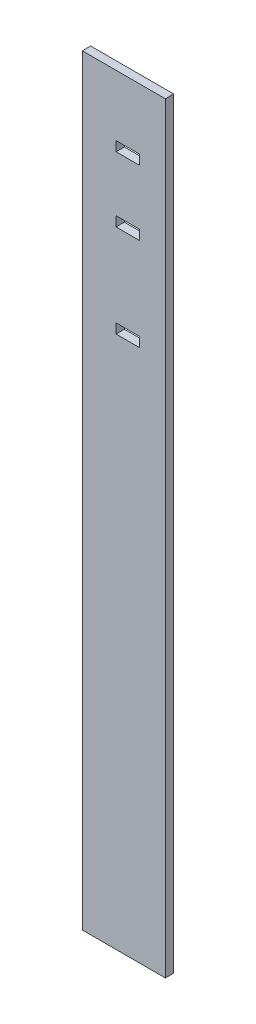
ISO-10303-21;
HEADER;
FILE_DESCRIPTION(('STEP AP214'),'2;1');
FILE_NAME('part.step','',(''),(''),'','','');
FILE_SCHEMA(('AUTOMOTIVE_DESIGN { 1 0 10303 214 1 1 1 1 }'));
ENDSEC;
DATA;
#1=APPLICATION_CONTEXT('core data for automotive mechanical design processes');
#2=APPLICATION_PROTOCOL_DEFINITION('international standard','automotive_design',2000,#1);
#3=PRODUCT_CONTEXT('',#1,'mechanical');
#4=PRODUCT('Part','Part','',(#3));
#5=PRODUCT_RELATED_PRODUCT_CATEGORY('part','',(#4));
#6=PRODUCT_DEFINITION_FORMATION('','',#4);
#7=PRODUCT_DEFINITION_CONTEXT('part definition',#1,'design');
#8=PRODUCT_DEFINITION('design','',#6,#7);
#9=PRODUCT_DEFINITION_SHAPE('','',#8);
#10=(LENGTH_UNIT() NAMED_UNIT(*) SI_UNIT(.MILLI.,.METRE.));
#11=(NAMED_UNIT(*) PLANE_ANGLE_UNIT() SI_UNIT($,.RADIAN.));
#12=(NAMED_UNIT(*) SI_UNIT($,.STERADIAN.) SOLID_ANGLE_UNIT());
#13=UNCERTAINTY_MEASURE_WITH_UNIT(LENGTH_MEASURE(1.E-05),#10,'distance_accuracy_value','');
#14=(GEOMETRIC_REPRESENTATION_CONTEXT(3) GLOBAL_UNCERTAINTY_ASSIGNED_CONTEXT((#13)) GLOBAL_UNIT_ASSIGNED_CONTEXT((#10,
#11,#12)) REPRESENTATION_CONTEXT('',''));
#15=CARTESIAN_POINT('',(0.,0.,0.));
#16=DIRECTION('',(0.,0.,1.));
#17=DIRECTION('',(1.,0.,0.));
#18=AXIS2_PLACEMENT_3D('',#15,#16,#17);
#19=CARTESIAN_POINT('',(15.,137.5,3.));
#20=DIRECTION('',(0.,-1.,0.));
#21=DIRECTION('',(0.,0.,-1.));
#22=AXIS2_PLACEMENT_3D('',#19,#20,#21);
#23=PLANE('',#22);
#24=DIRECTION('',(-1.,0.,0.));
#25=VECTOR('',#24,1.);
#26=CARTESIAN_POINT('',(15.,137.5,0.));
#27=LINE('',#26,#25);
#28=CARTESIAN_POINT('',(15.,137.5,0.));
#29=VERTEX_POINT('',#28);
#30=CARTESIAN_POINT('',(-15.,137.5,0.));
#31=VERTEX_POINT('',#30);
#32=EDGE_CURVE('E288',#29,#31,#27,.T.);
#33=ORIENTED_EDGE('',*,*,#32,.T.);
#34=DIRECTION('',(0.,0.,-1.));
#35=VECTOR('',#34,1.);
#36=CARTESIAN_POINT('',(-15.,137.5,3.));
#37=LINE('',#36,#35);
#38=CARTESIAN_POINT('',(-15.,137.5,3.));
#39=VERTEX_POINT('',#38);
#40=EDGE_CURVE('E11',#39,#31,#37,.T.);
#41=ORIENTED_EDGE('',*,*,#40,.F.);
#42=DIRECTION('',(-1.,0.,0.));
#43=VECTOR('',#42,1.);
#44=CARTESIAN_POINT('',(15.,137.5,3.));
#45=LINE('',#44,#43);
#46=CARTESIAN_POINT('',(15.,137.5,3.));
#47=VERTEX_POINT('',#46);
#48=EDGE_CURVE('E298',#47,#39,#45,.T.);
#49=ORIENTED_EDGE('',*,*,#48,.F.);
#50=DIRECTION('',(0.,0.,-1.));
#51=VECTOR('',#50,1.);
#52=CARTESIAN_POINT('',(15.,137.5,3.));
#53=LINE('',#52,#51);
#54=EDGE_CURVE('E312',#47,#29,#53,.T.);
#55=ORIENTED_EDGE('',*,*,#54,.T.);
#56=EDGE_LOOP('',(#33,#41,#49,#55));
#57=FACE_BOUND('',#56,.T.);
#58=ADVANCED_FACE('F46',(#57),#23,.F.);
#59=CARTESIAN_POINT('',(-15.,-137.5,3.));
#60=DIRECTION('',(1.,0.,0.));
#61=DIRECTION('',(0.,0.,-1.));
#62=AXIS2_PLACEMENT_3D('',#59,#60,#61);
#63=PLANE('',#62);
#64=DIRECTION('',(0.,-1.,0.));
#65=VECTOR('',#64,1.);
#66=CARTESIAN_POINT('',(-15.,-137.5,0.));
#67=LINE('',#66,#65);
#68=CARTESIAN_POINT('',(-15.,-137.5,0.));
#69=VERTEX_POINT('',#68);
#70=EDGE_CURVE('E316',#31,#69,#67,.T.);
#71=ORIENTED_EDGE('',*,*,#70,.T.);
#72=DIRECTION('',(0.,0.,-1.));
#73=VECTOR('',#72,1.);
#74=CARTESIAN_POINT('',(-15.,-137.5,3.));
#75=LINE('',#74,#73);
#76=CARTESIAN_POINT('',(-15.,-137.5,3.));
#77=VERTEX_POINT('',#76);
#78=EDGE_CURVE('E54',#77,#69,#75,.T.);
#79=ORIENTED_EDGE('',*,*,#78,.F.);
#80=DIRECTION('',(0.,-1.,0.));
#81=VECTOR('',#80,1.);
#82=CARTESIAN_POINT('',(-15.,-137.5,3.));
#83=LINE('',#82,#81);
#84=EDGE_CURVE('E302',#39,#77,#83,.T.);
#85=ORIENTED_EDGE('',*,*,#84,.F.);
#86=ORIENTED_EDGE('',*,*,#40,.T.);
#87=EDGE_LOOP('',(#71,#79,#85,#86));
#88=FACE_BOUND('',#87,.T.);
#89=ADVANCED_FACE('F351',(#88),#63,.F.);
#90=CARTESIAN_POINT('',(15.,-137.5,3.));
#91=DIRECTION('',(0.,1.,0.));
#92=DIRECTION('',(0.,0.,1.));
#93=AXIS2_PLACEMENT_3D('',#90,#91,#92);
#94=PLANE('',#93);
#95=DIRECTION('',(1.,0.,0.));
#96=VECTOR('',#95,1.);
#97=CARTESIAN_POINT('',(15.,-137.5,0.));
#98=LINE('',#97,#96);
#99=CARTESIAN_POINT('',(15.,-137.5,0.));
#100=VERTEX_POINT('',#99);
#101=EDGE_CURVE('E319',#69,#100,#98,.T.);
#102=ORIENTED_EDGE('',*,*,#101,.T.);
#103=DIRECTION('',(0.,0.,-1.));
#104=VECTOR('',#103,1.);
#105=CARTESIAN_POINT('',(15.,-137.5,3.));
#106=LINE('',#105,#104);
#107=CARTESIAN_POINT('',(15.,-137.5,3.));
#108=VERTEX_POINT('',#107);
#109=EDGE_CURVE('E327',#108,#100,#106,.T.);
#110=ORIENTED_EDGE('',*,*,#109,.F.);
#111=DIRECTION('',(1.,0.,0.));
#112=VECTOR('',#111,1.);
#113=CARTESIAN_POINT('',(15.,-137.5,3.));
#114=LINE('',#113,#112);
#115=EDGE_CURVE('E306',#77,#108,#114,.T.);
#116=ORIENTED_EDGE('',*,*,#115,.F.);
#117=ORIENTED_EDGE('',*,*,#78,.T.);
#118=EDGE_LOOP('',(#102,#110,#116,#117));
#119=FACE_BOUND('',#118,.T.);
#120=ADVANCED_FACE('F336',(#119),#94,.F.);
#121=CARTESIAN_POINT('',(15.,-137.5,3.));
#122=DIRECTION('',(-1.,0.,0.));
#123=DIRECTION('',(0.,0.,1.));
#124=AXIS2_PLACEMENT_3D('',#121,#122,#123);
#125=PLANE('',#124);
#126=DIRECTION('',(0.,1.,0.));
#127=VECTOR('',#126,1.);
#128=CARTESIAN_POINT('',(15.,-137.5,0.));
#129=LINE('',#128,#127);
#130=EDGE_CURVE('E303',#100,#29,#129,.T.);
#131=ORIENTED_EDGE('',*,*,#130,.T.);
#132=ORIENTED_EDGE('',*,*,#54,.F.);
#133=DIRECTION('',(0.,1.,0.));
#134=VECTOR('',#133,1.);
#135=CARTESIAN_POINT('',(15.,-137.5,3.));
#136=LINE('',#135,#134);
#137=EDGE_CURVE('E309',#108,#47,#136,.T.);
#138=ORIENTED_EDGE('',*,*,#137,.F.);
#139=ORIENTED_EDGE('',*,*,#109,.T.);
#140=EDGE_LOOP('',(#131,#132,#138,#139));
#141=FACE_BOUND('',#140,.T.);
#142=ADVANCED_FACE('F345',(#141),#125,.F.);
#143=CARTESIAN_POINT('',(0.,0.,3.));
#144=DIRECTION('',(0.,0.,-1.));
#145=DIRECTION('',(-1.,0.,0.));
#146=AXIS2_PLACEMENT_3D('',#143,#144,#145);
#147=PLANE('',#146);
#148=DIRECTION('',(0.,1.,0.));
#149=VECTOR('',#148,1.);
#150=CARTESIAN_POINT('',(-2.80924040930811,0.,3.));
#151=LINE('',#150,#149);
#152=CARTESIAN_POINT('',(-2.80924040930811,54.9999999999997,3.));
#153=VERTEX_POINT('',#152);
#154=CARTESIAN_POINT('',(-2.80924040930811,58.4999999999997,3.));
#155=VERTEX_POINT('',#154);
#156=EDGE_CURVE('E224',#153,#155,#151,.T.);
#157=ORIENTED_EDGE('',*,*,#156,.T.);
#158=DIRECTION('',(1.,0.,0.));
#159=VECTOR('',#158,1.);
#160=CARTESIAN_POINT('',(0.,58.4999999999997,3.));
#161=LINE('',#160,#159);
#162=CARTESIAN_POINT('',(5.69075959069189,58.4999999999997,3.));
#163=VERTEX_POINT('',#162);
#164=EDGE_CURVE('E213',#155,#163,#161,.T.);
#165=ORIENTED_EDGE('',*,*,#164,.T.);
#166=DIRECTION('',(0.,-1.,0.));
#167=VECTOR('',#166,1.);
#168=CARTESIAN_POINT('',(5.69075959069189,0.,3.));
#169=LINE('',#168,#167);
#170=CARTESIAN_POINT('',(5.69075959069189,54.9999999999997,3.));
#171=VERTEX_POINT('',#170);
#172=EDGE_CURVE('E217',#163,#171,#169,.T.);
#173=ORIENTED_EDGE('',*,*,#172,.T.);
#174=DIRECTION('',(-1.,0.,0.));
#175=VECTOR('',#174,1.);
#176=CARTESIAN_POINT('',(0.,54.9999999999997,3.));
#177=LINE('',#176,#175);
#178=EDGE_CURVE('E61',#171,#153,#177,.T.);
#179=ORIENTED_EDGE('',*,*,#178,.T.);
#180=EDGE_LOOP('',(#157,#165,#173,#179));
#181=FACE_BOUND('',#180,.T.);
#182=DIRECTION('',(0.,-1.,0.));
#183=VECTOR('',#182,1.);
#184=CARTESIAN_POINT('',(5.69075959069187,0.,3.));
#185=LINE('',#184,#183);
#186=CARTESIAN_POINT('',(5.6907595906919,115.5,3.));
#187=VERTEX_POINT('',#186);
#188=CARTESIAN_POINT('',(5.6907595906919,112.,3.));
#189=VERTEX_POINT('',#188);
#190=EDGE_CURVE('E172',#187,#189,#185,.T.);
#191=ORIENTED_EDGE('',*,*,#190,.T.);
#192=DIRECTION('',(-1.,0.,0.));
#193=VECTOR('',#192,1.);
#194=CARTESIAN_POINT('',(0.,112.,3.));
#195=LINE('',#194,#193);
#196=CARTESIAN_POINT('',(-2.8092404093081,112.,3.));
#197=VERTEX_POINT('',#196);
#198=EDGE_CURVE('E163',#189,#197,#195,.T.);
#199=ORIENTED_EDGE('',*,*,#198,.T.);
#200=DIRECTION('',(0.,1.,0.));
#201=VECTOR('',#200,1.);
#202=CARTESIAN_POINT('',(-2.80924040930813,0.,3.));
#203=LINE('',#202,#201);
#204=CARTESIAN_POINT('',(-2.8092404093081,115.5,3.));
#205=VERTEX_POINT('',#204);
#206=EDGE_CURVE('E175',#197,#205,#203,.T.);
#207=ORIENTED_EDGE('',*,*,#206,.T.);
#208=DIRECTION('',(1.,0.,0.));
#209=VECTOR('',#208,1.);
#210=CARTESIAN_POINT('',(0.,115.5,3.));
#211=LINE('',#210,#209);
#212=EDGE_CURVE('E69',#205,#187,#211,.T.);
#213=ORIENTED_EDGE('',*,*,#212,.T.);
#214=EDGE_LOOP('',(#191,#199,#207,#213));
#215=FACE_BOUND('',#214,.T.);
#216=DIRECTION('',(0.,1.,0.));
#217=VECTOR('',#216,1.);
#218=CARTESIAN_POINT('',(-2.8092404093081,0.,3.));
#219=LINE('',#218,#217);
#220=CARTESIAN_POINT('',(-2.8092404093081,88.4999999999997,3.));
#221=VERTEX_POINT('',#220);
#222=CARTESIAN_POINT('',(-2.8092404093081,91.9999999999997,3.));
#223=VERTEX_POINT('',#222);
#224=EDGE_CURVE('E267',#221,#223,#219,.T.);
#225=ORIENTED_EDGE('',*,*,#224,.T.);
#226=DIRECTION('',(1.,0.,0.));
#227=VECTOR('',#226,1.);
#228=CARTESIAN_POINT('',(0.,91.9999999999997,3.));
#229=LINE('',#228,#227);
#230=CARTESIAN_POINT('',(5.6907595906919,91.9999999999997,3.));
#231=VERTEX_POINT('',#230);
#232=EDGE_CURVE('E254',#223,#231,#229,.T.);
#233=ORIENTED_EDGE('',*,*,#232,.T.);
#234=DIRECTION('',(0.,-1.,0.));
#235=VECTOR('',#234,1.);
#236=CARTESIAN_POINT('',(5.69075959069185,0.,3.));
#237=LINE('',#236,#235);
#238=CARTESIAN_POINT('',(5.6907595906919,88.4999999999997,3.));
#239=VERTEX_POINT('',#238);
#240=EDGE_CURVE('E258',#231,#239,#237,.T.);
#241=ORIENTED_EDGE('',*,*,#240,.T.);
#242=DIRECTION('',(-1.,0.,0.));
#243=VECTOR('',#242,1.);
#244=CARTESIAN_POINT('',(0.,88.4999999999997,3.));
#245=LINE('',#244,#243);
#246=EDGE_CURVE('E263',#239,#221,#245,.T.);
#247=ORIENTED_EDGE('',*,*,#246,.T.);
#248=EDGE_LOOP('',(#225,#233,#241,#247));
#249=FACE_BOUND('',#248,.T.);
#250=ORIENTED_EDGE('',*,*,#48,.T.);
#251=ORIENTED_EDGE('',*,*,#84,.T.);
#252=ORIENTED_EDGE('',*,*,#115,.T.);
#253=ORIENTED_EDGE('',*,*,#137,.T.);
#254=EDGE_LOOP('',(#250,#251,#252,#253));
#255=FACE_BOUND('',#254,.T.);
#256=ADVANCED_FACE('F180',(#181,#215,#249,#255),#147,.F.);
#257=CARTESIAN_POINT('',(0.,0.,0.));
#258=DIRECTION('',(0.,0.,-1.));
#259=DIRECTION('',(-1.,0.,0.));
#260=AXIS2_PLACEMENT_3D('',#257,#258,#259);
#261=PLANE('',#260);
#262=DIRECTION('',(1.,0.,0.));
#263=VECTOR('',#262,1.);
#264=CARTESIAN_POINT('',(0.,58.4999999999997,0.));
#265=LINE('',#264,#263);
#266=CARTESIAN_POINT('',(-2.80924040930811,58.4999999999997,0.));
#267=VERTEX_POINT('',#266);
#268=CARTESIAN_POINT('',(5.69075959069189,58.4999999999997,0.));
#269=VERTEX_POINT('',#268);
#270=EDGE_CURVE('E229',#267,#269,#265,.T.);
#271=ORIENTED_EDGE('',*,*,#270,.F.);
#272=DIRECTION('',(0.,1.,0.));
#273=VECTOR('',#272,1.);
#274=CARTESIAN_POINT('',(-2.80924040930811,0.,0.));
#275=LINE('',#274,#273);
#276=CARTESIAN_POINT('',(-2.80924040930811,54.9999999999997,0.));
#277=VERTEX_POINT('',#276);
#278=EDGE_CURVE('E218',#277,#267,#275,.T.);
#279=ORIENTED_EDGE('',*,*,#278,.F.);
#280=DIRECTION('',(-1.,0.,0.));
#281=VECTOR('',#280,1.);
#282=CARTESIAN_POINT('',(0.,54.9999999999997,0.));
#283=LINE('',#282,#281);
#284=CARTESIAN_POINT('',(5.69075959069189,54.9999999999997,0.));
#285=VERTEX_POINT('',#284);
#286=EDGE_CURVE('E236',#285,#277,#283,.T.);
#287=ORIENTED_EDGE('',*,*,#286,.F.);
#288=DIRECTION('',(0.,-1.,0.));
#289=VECTOR('',#288,1.);
#290=CARTESIAN_POINT('',(5.69075959069189,0.,0.));
#291=LINE('',#290,#289);
#292=EDGE_CURVE('E232',#269,#285,#291,.T.);
#293=ORIENTED_EDGE('',*,*,#292,.F.);
#294=EDGE_LOOP('',(#271,#279,#287,#293));
#295=FACE_BOUND('',#294,.T.);
#296=DIRECTION('',(-1.,0.,0.));
#297=VECTOR('',#296,1.);
#298=CARTESIAN_POINT('',(0.,112.,0.));
#299=LINE('',#298,#297);
#300=CARTESIAN_POINT('',(5.6907595906919,112.,0.));
#301=VERTEX_POINT('',#300);
#302=CARTESIAN_POINT('',(-2.8092404093081,112.,0.));
#303=VERTEX_POINT('',#302);
#304=EDGE_CURVE('E166',#301,#303,#299,.T.);
#305=ORIENTED_EDGE('',*,*,#304,.F.);
#306=DIRECTION('',(0.,-1.,0.));
#307=VECTOR('',#306,1.);
#308=CARTESIAN_POINT('',(5.69075959069187,0.,0.));
#309=LINE('',#308,#307);
#310=CARTESIAN_POINT('',(5.6907595906919,115.5,0.));
#311=VERTEX_POINT('',#310);
#312=EDGE_CURVE('E184',#311,#301,#309,.T.);
#313=ORIENTED_EDGE('',*,*,#312,.F.);
#314=DIRECTION('',(1.,0.,0.));
#315=VECTOR('',#314,1.);
#316=CARTESIAN_POINT('',(0.,115.5,0.));
#317=LINE('',#316,#315);
#318=CARTESIAN_POINT('',(-2.8092404093081,115.5,0.));
#319=VERTEX_POINT('',#318);
#320=EDGE_CURVE('E188',#319,#311,#317,.T.);
#321=ORIENTED_EDGE('',*,*,#320,.F.);
#322=DIRECTION('',(0.,1.,0.));
#323=VECTOR('',#322,1.);
#324=CARTESIAN_POINT('',(-2.80924040930813,0.,0.));
#325=LINE('',#324,#323);
#326=EDGE_CURVE('E197',#303,#319,#325,.T.);
#327=ORIENTED_EDGE('',*,*,#326,.F.);
#328=EDGE_LOOP('',(#305,#313,#321,#327));
#329=FACE_BOUND('',#328,.T.);
#330=DIRECTION('',(1.,0.,0.));
#331=VECTOR('',#330,1.);
#332=CARTESIAN_POINT('',(0.,91.9999999999997,0.));
#333=LINE('',#332,#331);
#334=CARTESIAN_POINT('',(-2.8092404093081,91.9999999999997,0.));
#335=VERTEX_POINT('',#334);
#336=CARTESIAN_POINT('',(5.6907595906919,91.9999999999997,0.));
#337=VERTEX_POINT('',#336);
#338=EDGE_CURVE('E207',#335,#337,#333,.T.);
#339=ORIENTED_EDGE('',*,*,#338,.F.);
#340=DIRECTION('',(0.,1.,0.));
#341=VECTOR('',#340,1.);
#342=CARTESIAN_POINT('',(-2.8092404093081,0.,0.));
#343=LINE('',#342,#341);
#344=CARTESIAN_POINT('',(-2.8092404093081,88.4999999999997,0.));
#345=VERTEX_POINT('',#344);
#346=EDGE_CURVE('E259',#345,#335,#343,.T.);
#347=ORIENTED_EDGE('',*,*,#346,.F.);
#348=DIRECTION('',(-1.,0.,0.));
#349=VECTOR('',#348,1.);
#350=CARTESIAN_POINT('',(0.,88.4999999999997,0.));
#351=LINE('',#350,#349);
#352=CARTESIAN_POINT('',(5.6907595906919,88.4999999999997,0.));
#353=VERTEX_POINT('',#352);
#354=EDGE_CURVE('E278',#353,#345,#351,.T.);
#355=ORIENTED_EDGE('',*,*,#354,.F.);
#356=DIRECTION('',(0.,-1.,0.));
#357=VECTOR('',#356,1.);
#358=CARTESIAN_POINT('',(5.69075959069185,0.,0.));
#359=LINE('',#358,#357);
#360=EDGE_CURVE('E274',#337,#353,#359,.T.);
#361=ORIENTED_EDGE('',*,*,#360,.F.);
#362=EDGE_LOOP('',(#339,#347,#355,#361));
#363=FACE_BOUND('',#362,.T.);
#364=ORIENTED_EDGE('',*,*,#32,.F.);
#365=ORIENTED_EDGE('',*,*,#130,.F.);
#366=ORIENTED_EDGE('',*,*,#101,.F.);
#367=ORIENTED_EDGE('',*,*,#70,.F.);
#368=EDGE_LOOP('',(#364,#365,#366,#367));
#369=FACE_BOUND('',#368,.T.);
#370=ADVANCED_FACE('F342',(#295,#329,#363,#369),#261,.T.);
#371=CARTESIAN_POINT('',(0.,91.9999999999997,3.));
#372=DIRECTION('',(0.,1.,0.));
#373=DIRECTION('',(0.,0.,1.));
#374=AXIS2_PLACEMENT_3D('',#371,#372,#373);
#375=PLANE('',#374);
#376=ORIENTED_EDGE('',*,*,#338,.T.);
#377=DIRECTION('',(0.,0.,-1.));
#378=VECTOR('',#377,1.);
#379=CARTESIAN_POINT('',(5.6907595906919,91.9999999999997,3.));
#380=LINE('',#379,#378);
#381=EDGE_CURVE('E271',#231,#337,#380,.T.);
#382=ORIENTED_EDGE('',*,*,#381,.F.);
#383=ORIENTED_EDGE('',*,*,#232,.F.);
#384=DIRECTION('',(0.,0.,-1.));
#385=VECTOR('',#384,1.);
#386=CARTESIAN_POINT('',(-2.8092404093081,91.9999999999997,3.));
#387=LINE('',#386,#385);
#388=EDGE_CURVE('E285',#223,#335,#387,.T.);
#389=ORIENTED_EDGE('',*,*,#388,.T.);
#390=EDGE_LOOP('',(#376,#382,#383,#389));
#391=FACE_BOUND('',#390,.T.);
#392=ADVANCED_FACE('F362',(#391),#375,.F.);
#393=CARTESIAN_POINT('',(-2.8092404093081,0.,3.));
#394=DIRECTION('',(-1.,0.,0.));
#395=DIRECTION('',(0.,0.,1.));
#396=AXIS2_PLACEMENT_3D('',#393,#394,#395);
#397=PLANE('',#396);
#398=ORIENTED_EDGE('',*,*,#346,.T.);
#399=ORIENTED_EDGE('',*,*,#388,.F.);
#400=ORIENTED_EDGE('',*,*,#224,.F.);
#401=DIRECTION('',(0.,0.,-1.));
#402=VECTOR('',#401,1.);
#403=CARTESIAN_POINT('',(-2.8092404093081,88.4999999999997,3.));
#404=LINE('',#403,#402);
#405=EDGE_CURVE('E289',#221,#345,#404,.T.);
#406=ORIENTED_EDGE('',*,*,#405,.T.);
#407=EDGE_LOOP('',(#398,#399,#400,#406));
#408=FACE_BOUND('',#407,.T.);
#409=ADVANCED_FACE('F369',(#408),#397,.F.);
#410=CARTESIAN_POINT('',(0.,88.4999999999997,3.));
#411=DIRECTION('',(0.,-1.,0.));
#412=DIRECTION('',(0.,0.,-1.));
#413=AXIS2_PLACEMENT_3D('',#410,#411,#412);
#414=PLANE('',#413);
#415=ORIENTED_EDGE('',*,*,#354,.T.);
#416=ORIENTED_EDGE('',*,*,#405,.F.);
#417=ORIENTED_EDGE('',*,*,#246,.F.);
#418=DIRECTION('',(0.,0.,-1.));
#419=VECTOR('',#418,1.);
#420=CARTESIAN_POINT('',(5.6907595906919,88.4999999999997,3.));
#421=LINE('',#420,#419);
#422=EDGE_CURVE('E292',#239,#353,#421,.T.);
#423=ORIENTED_EDGE('',*,*,#422,.T.);
#424=EDGE_LOOP('',(#415,#416,#417,#423));
#425=FACE_BOUND('',#424,.T.);
#426=ADVANCED_FACE('F374',(#425),#414,.F.);
#427=CARTESIAN_POINT('',(5.69075959069185,0.,3.));
#428=DIRECTION('',(1.,0.,0.));
#429=DIRECTION('',(0.,1.,0.));
#430=AXIS2_PLACEMENT_3D('',#427,#428,#429);
#431=PLANE('',#430);
#432=ORIENTED_EDGE('',*,*,#360,.T.);
#433=ORIENTED_EDGE('',*,*,#422,.F.);
#434=ORIENTED_EDGE('',*,*,#240,.F.);
#435=ORIENTED_EDGE('',*,*,#381,.T.);
#436=EDGE_LOOP('',(#432,#433,#434,#435));
#437=FACE_BOUND('',#436,.T.);
#438=ADVANCED_FACE('F371',(#437),#431,.F.);
#439=CARTESIAN_POINT('',(0.,112.,3.));
#440=DIRECTION('',(0.,-1.,0.));
#441=DIRECTION('',(0.,0.,-1.));
#442=AXIS2_PLACEMENT_3D('',#439,#440,#441);
#443=PLANE('',#442);
#444=ORIENTED_EDGE('',*,*,#304,.T.);
#445=DIRECTION('',(0.,0.,-1.));
#446=VECTOR('',#445,1.);
#447=CARTESIAN_POINT('',(-2.8092404093081,112.,3.));
#448=LINE('',#447,#446);
#449=EDGE_CURVE('E159',#197,#303,#448,.T.);
#450=ORIENTED_EDGE('',*,*,#449,.F.);
#451=ORIENTED_EDGE('',*,*,#198,.F.);
#452=DIRECTION('',(0.,0.,-1.));
#453=VECTOR('',#452,1.);
#454=CARTESIAN_POINT('',(5.6907595906919,112.,3.));
#455=LINE('',#454,#453);
#456=EDGE_CURVE('E204',#189,#301,#455,.T.);
#457=ORIENTED_EDGE('',*,*,#456,.T.);
#458=EDGE_LOOP('',(#444,#450,#451,#457));
#459=FACE_BOUND('',#458,.T.);
#460=ADVANCED_FACE('F161',(#459),#443,.F.);
#461=CARTESIAN_POINT('',(5.69075959069187,0.,3.));
#462=DIRECTION('',(1.,0.,0.));
#463=DIRECTION('',(0.,1.,0.));
#464=AXIS2_PLACEMENT_3D('',#461,#462,#463);
#465=PLANE('',#464);
#466=ORIENTED_EDGE('',*,*,#312,.T.);
#467=ORIENTED_EDGE('',*,*,#456,.F.);
#468=ORIENTED_EDGE('',*,*,#190,.F.);
#469=DIRECTION('',(0.,0.,-1.));
#470=VECTOR('',#469,1.);
#471=CARTESIAN_POINT('',(5.6907595906919,115.5,3.));
#472=LINE('',#471,#470);
#473=EDGE_CURVE('E208',#187,#311,#472,.T.);
#474=ORIENTED_EDGE('',*,*,#473,.T.);
#475=EDGE_LOOP('',(#466,#467,#468,#474));
#476=FACE_BOUND('',#475,.T.);
#477=ADVANCED_FACE('F399',(#476),#465,.F.);
#478=CARTESIAN_POINT('',(0.,115.5,3.));
#479=DIRECTION('',(0.,1.,0.));
#480=DIRECTION('',(0.,0.,1.));
#481=AXIS2_PLACEMENT_3D('',#478,#479,#480);
#482=PLANE('',#481);
#483=ORIENTED_EDGE('',*,*,#320,.T.);
#484=ORIENTED_EDGE('',*,*,#473,.F.);
#485=ORIENTED_EDGE('',*,*,#212,.F.);
#486=DIRECTION('',(0.,0.,-1.));
#487=VECTOR('',#486,1.);
#488=CARTESIAN_POINT('',(-2.8092404093081,115.5,3.));
#489=LINE('',#488,#487);
#490=EDGE_CURVE('E171',#205,#319,#489,.T.);
#491=ORIENTED_EDGE('',*,*,#490,.T.);
#492=EDGE_LOOP('',(#483,#484,#485,#491));
#493=FACE_BOUND('',#492,.T.);
#494=ADVANCED_FACE('F402',(#493),#482,.F.);
#495=CARTESIAN_POINT('',(-2.80924040930813,0.,3.));
#496=DIRECTION('',(-1.,0.,0.));
#497=DIRECTION('',(0.,-1.,0.));
#498=AXIS2_PLACEMENT_3D('',#495,#496,#497);
#499=PLANE('',#498);
#500=ORIENTED_EDGE('',*,*,#326,.T.);
#501=ORIENTED_EDGE('',*,*,#490,.F.);
#502=ORIENTED_EDGE('',*,*,#206,.F.);
#503=ORIENTED_EDGE('',*,*,#449,.T.);
#504=EDGE_LOOP('',(#500,#501,#502,#503));
#505=FACE_BOUND('',#504,.T.);
#506=ADVANCED_FACE('F176',(#505),#499,.F.);
#507=CARTESIAN_POINT('',(0.,58.4999999999997,3.));
#508=DIRECTION('',(0.,1.,0.));
#509=DIRECTION('',(-1.,0.,0.));
#510=AXIS2_PLACEMENT_3D('',#507,#508,#509);
#511=PLANE('',#510);
#512=ORIENTED_EDGE('',*,*,#270,.T.);
#513=DIRECTION('',(0.,0.,-1.));
#514=VECTOR('',#513,1.);
#515=CARTESIAN_POINT('',(5.69075959069189,58.4999999999997,3.));
#516=LINE('',#515,#514);
#517=EDGE_CURVE('E228',#163,#269,#516,.T.);
#518=ORIENTED_EDGE('',*,*,#517,.F.);
#519=ORIENTED_EDGE('',*,*,#164,.F.);
#520=DIRECTION('',(0.,0.,-1.));
#521=VECTOR('',#520,1.);
#522=CARTESIAN_POINT('',(-2.80924040930811,58.4999999999997,3.));
#523=LINE('',#522,#521);
#524=EDGE_CURVE('E198',#155,#267,#523,.T.);
#525=ORIENTED_EDGE('',*,*,#524,.T.);
#526=EDGE_LOOP('',(#512,#518,#519,#525));
#527=FACE_BOUND('',#526,.T.);
#528=ADVANCED_FACE('F382',(#527),#511,.F.);
#529=CARTESIAN_POINT('',(-2.80924040930811,0.,3.));
#530=DIRECTION('',(-1.,0.,0.));
#531=DIRECTION('',(0.,0.,1.));
#532=AXIS2_PLACEMENT_3D('',#529,#530,#531);
#533=PLANE('',#532);
#534=ORIENTED_EDGE('',*,*,#278,.T.);
#535=ORIENTED_EDGE('',*,*,#524,.F.);
#536=ORIENTED_EDGE('',*,*,#156,.F.);
#537=DIRECTION('',(0.,0.,-1.));
#538=VECTOR('',#537,1.);
#539=CARTESIAN_POINT('',(-2.80924040930811,54.9999999999997,3.));
#540=LINE('',#539,#538);
#541=EDGE_CURVE('E245',#153,#277,#540,.T.);
#542=ORIENTED_EDGE('',*,*,#541,.T.);
#543=EDGE_LOOP('',(#534,#535,#536,#542));
#544=FACE_BOUND('',#543,.T.);
#545=ADVANCED_FACE('F385',(#544),#533,.F.);
#546=CARTESIAN_POINT('',(0.,54.9999999999997,3.));
#547=DIRECTION('',(0.,-1.,0.));
#548=DIRECTION('',(0.,0.,-1.));
#549=AXIS2_PLACEMENT_3D('',#546,#547,#548);
#550=PLANE('',#549);
#551=ORIENTED_EDGE('',*,*,#286,.T.);
#552=ORIENTED_EDGE('',*,*,#541,.F.);
#553=ORIENTED_EDGE('',*,*,#178,.F.);
#554=DIRECTION('',(0.,0.,-1.));
#555=VECTOR('',#554,1.);
#556=CARTESIAN_POINT('',(5.69075959069189,54.9999999999997,3.));
#557=LINE('',#556,#555);
#558=EDGE_CURVE('E248',#171,#285,#557,.T.);
#559=ORIENTED_EDGE('',*,*,#558,.T.);
#560=EDGE_LOOP('',(#551,#552,#553,#559));
#561=FACE_BOUND('',#560,.T.);
#562=ADVANCED_FACE('F390',(#561),#550,.F.);
#563=CARTESIAN_POINT('',(5.69075959069189,0.,3.));
#564=DIRECTION('',(1.,0.,0.));
#565=DIRECTION('',(0.,0.,-1.));
#566=AXIS2_PLACEMENT_3D('',#563,#564,#565);
#567=PLANE('',#566);
#568=ORIENTED_EDGE('',*,*,#292,.T.);
#569=ORIENTED_EDGE('',*,*,#558,.F.);
#570=ORIENTED_EDGE('',*,*,#172,.F.);
#571=ORIENTED_EDGE('',*,*,#517,.T.);
#572=EDGE_LOOP('',(#568,#569,#570,#571));
#573=FACE_BOUND('',#572,.T.);
#574=ADVANCED_FACE('F387',(#573),#567,.F.);
#575=CLOSED_SHELL('',(#58,#89,#120,#142,#256,#370,#392,#409,#426,#438,#460,#477,#494,#506,#528,
#545,#562,#574));
#576=MANIFOLD_SOLID_BREP('B2',#575);
#577=ADVANCED_BREP_SHAPE_REPRESENTATION('',(#18,#576),#14);
#578=SHAPE_DEFINITION_REPRESENTATION(#9,#577);
ENDSEC;
END-ISO-10303-21;
